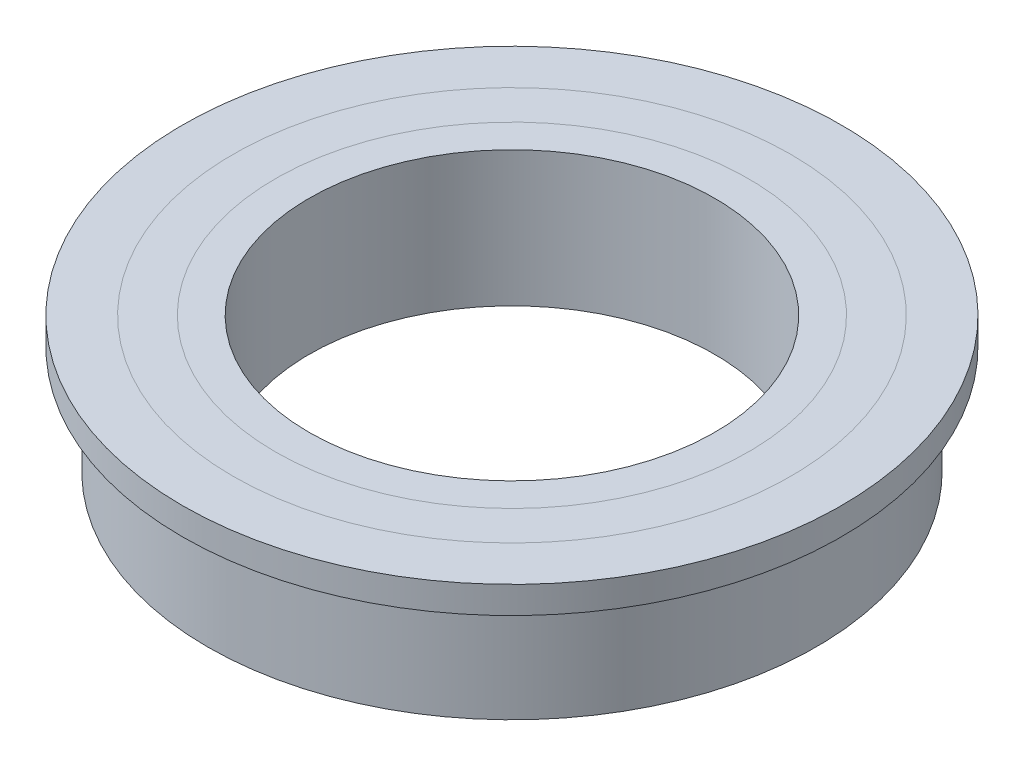
ISO-10303-21;
HEADER;
FILE_DESCRIPTION(('STEP AP214'),'2;1');
FILE_NAME('part.step','',(''),(''),'','','');
FILE_SCHEMA(('AUTOMOTIVE_DESIGN { 1 0 10303 214 1 1 1 1 }'));
ENDSEC;
DATA;
#1=APPLICATION_CONTEXT('core data for automotive mechanical design processes');
#2=APPLICATION_PROTOCOL_DEFINITION('international standard','automotive_design',2000,#1);
#3=PRODUCT_CONTEXT('',#1,'mechanical');
#4=PRODUCT('Part','Part','',(#3));
#5=PRODUCT_RELATED_PRODUCT_CATEGORY('part','',(#4));
#6=PRODUCT_DEFINITION_FORMATION('','',#4);
#7=PRODUCT_DEFINITION_CONTEXT('part definition',#1,'design');
#8=PRODUCT_DEFINITION('design','',#6,#7);
#9=PRODUCT_DEFINITION_SHAPE('','',#8);
#10=(LENGTH_UNIT() NAMED_UNIT(*) SI_UNIT(.MILLI.,.METRE.));
#11=(NAMED_UNIT(*) PLANE_ANGLE_UNIT() SI_UNIT($,.RADIAN.));
#12=(NAMED_UNIT(*) SI_UNIT($,.STERADIAN.) SOLID_ANGLE_UNIT());
#13=UNCERTAINTY_MEASURE_WITH_UNIT(LENGTH_MEASURE(1.E-05),#10,'distance_accuracy_value','');
#14=(GEOMETRIC_REPRESENTATION_CONTEXT(3) GLOBAL_UNCERTAINTY_ASSIGNED_CONTEXT((#13)) GLOBAL_UNIT_ASSIGNED_CONTEXT((#10,
#11,#12)) REPRESENTATION_CONTEXT('',''));
#15=CARTESIAN_POINT('',(0.,0.,0.));
#16=DIRECTION('',(0.,0.,1.));
#17=DIRECTION('',(1.,0.,0.));
#18=AXIS2_PLACEMENT_3D('',#15,#16,#17);
#19=CARTESIAN_POINT('',(0.,4.01,0.));
#20=DIRECTION('',(0.,-1.,0.));
#21=DIRECTION('',(0.,0.,-1.));
#22=AXIS2_PLACEMENT_3D('',#19,#20,#21);
#23=CYLINDRICAL_SURFACE('',#22,7.);
#24=CARTESIAN_POINT('',(0.,4.,0.));
#25=DIRECTION('',(0.,1.,0.));
#26=DIRECTION('',(0.,0.,1.));
#27=AXIS2_PLACEMENT_3D('',#24,#25,#26);
#28=CIRCLE('',#27,7.);
#29=CARTESIAN_POINT('',(0.,4.,7.));
#30=VERTEX_POINT('',#29);
#31=EDGE_CURVE('E47',#30,#30,#28,.T.);
#32=ORIENTED_EDGE('',*,*,#31,.T.);
#33=EDGE_LOOP('',(#32));
#34=FACE_BOUND('',#33,.T.);
#35=CARTESIAN_POINT('',(0.,0.,0.));
#36=DIRECTION('',(0.,1.,0.));
#37=DIRECTION('',(0.,0.,1.));
#38=AXIS2_PLACEMENT_3D('',#35,#36,#37);
#39=CIRCLE('',#38,7.);
#40=CARTESIAN_POINT('',(0.,0.,7.));
#41=VERTEX_POINT('',#40);
#42=EDGE_CURVE('E11',#41,#41,#39,.T.);
#43=ORIENTED_EDGE('',*,*,#42,.F.);
#44=EDGE_LOOP('',(#43));
#45=FACE_BOUND('',#44,.T.);
#46=ADVANCED_FACE('F43',(#34,#45),#23,.F.);
#47=CARTESIAN_POINT('',(0.,4.01,0.));
#48=DIRECTION('',(0.,-1.,0.));
#49=DIRECTION('',(0.,0.,-1.));
#50=AXIS2_PLACEMENT_3D('',#47,#48,#49);
#51=CYLINDRICAL_SURFACE('',#50,8.25);
#52=CARTESIAN_POINT('',(0.,0.,0.));
#53=DIRECTION('',(0.,1.,0.));
#54=DIRECTION('',(0.,0.,1.));
#55=AXIS2_PLACEMENT_3D('',#52,#53,#54);
#56=CIRCLE('',#55,8.25);
#57=CARTESIAN_POINT('',(0.,0.,8.25));
#58=VERTEX_POINT('',#57);
#59=EDGE_CURVE('E57',#58,#58,#56,.T.);
#60=ORIENTED_EDGE('',*,*,#59,.T.);
#61=EDGE_LOOP('',(#60));
#62=FACE_BOUND('',#61,.T.);
#63=CARTESIAN_POINT('',(0.,4.,0.));
#64=DIRECTION('',(0.,1.,0.));
#65=DIRECTION('',(0.,0.,1.));
#66=AXIS2_PLACEMENT_3D('',#63,#64,#65);
#67=CIRCLE('',#66,8.25);
#68=CARTESIAN_POINT('',(0.,4.,8.25));
#69=VERTEX_POINT('',#68);
#70=EDGE_CURVE('E51',#69,#69,#67,.T.);
#71=ORIENTED_EDGE('',*,*,#70,.F.);
#72=EDGE_LOOP('',(#71));
#73=FACE_BOUND('',#72,.T.);
#74=ADVANCED_FACE('F69',(#62,#73),#51,.T.);
#75=CARTESIAN_POINT('',(0.,0.,0.));
#76=DIRECTION('',(0.,1.,0.));
#77=DIRECTION('',(0.,0.,1.));
#78=AXIS2_PLACEMENT_3D('',#75,#76,#77);
#79=PLANE('',#78);
#80=ORIENTED_EDGE('',*,*,#42,.T.);
#81=EDGE_LOOP('',(#80));
#82=FACE_BOUND('',#81,.T.);
#83=ORIENTED_EDGE('',*,*,#59,.F.);
#84=EDGE_LOOP('',(#83));
#85=FACE_BOUND('',#84,.T.);
#86=ADVANCED_FACE('F68',(#82,#85),#79,.F.);
#87=CARTESIAN_POINT('',(0.,4.,0.));
#88=DIRECTION('',(0.,1.,0.));
#89=DIRECTION('',(0.,0.,1.));
#90=AXIS2_PLACEMENT_3D('',#87,#88,#89);
#91=PLANE('',#90);
#92=ORIENTED_EDGE('',*,*,#31,.F.);
#93=EDGE_LOOP('',(#92));
#94=FACE_BOUND('',#93,.T.);
#95=ORIENTED_EDGE('',*,*,#70,.T.);
#96=EDGE_LOOP('',(#95));
#97=FACE_BOUND('',#96,.T.);
#98=ADVANCED_FACE('F45',(#94,#97),#91,.T.);
#99=CLOSED_SHELL('',(#46,#74,#86,#98));
#100=MANIFOLD_SOLID_BREP('B2',#99);
#101=CARTESIAN_POINT('',(0.,4.01,0.));
#102=DIRECTION('',(0.,-1.,0.));
#103=DIRECTION('',(0.,0.,-1.));
#104=AXIS2_PLACEMENT_3D('',#101,#102,#103);
#105=CYLINDRICAL_SURFACE('',#104,7.);
#106=CARTESIAN_POINT('',(0.,0.,0.));
#107=DIRECTION('',(0.,1.,0.));
#108=DIRECTION('',(0.,0.,1.));
#109=AXIS2_PLACEMENT_3D('',#106,#107,#108);
#110=CIRCLE('',#109,7.);
#111=CARTESIAN_POINT('',(0.,0.,7.));
#112=VERTEX_POINT('',#111);
#113=EDGE_CURVE('E128',#112,#112,#110,.T.);
#114=ORIENTED_EDGE('',*,*,#113,.T.);
#115=EDGE_LOOP('',(#114));
#116=FACE_BOUND('',#115,.T.);
#117=CARTESIAN_POINT('',(0.,4.,0.));
#118=DIRECTION('',(0.,1.,0.));
#119=DIRECTION('',(0.,0.,1.));
#120=AXIS2_PLACEMENT_3D('',#117,#118,#119);
#121=CIRCLE('',#120,7.);
#122=CARTESIAN_POINT('',(0.,4.,7.));
#123=VERTEX_POINT('',#122);
#124=EDGE_CURVE('E118',#123,#123,#121,.T.);
#125=ORIENTED_EDGE('',*,*,#124,.F.);
#126=EDGE_LOOP('',(#125));
#127=FACE_BOUND('',#126,.T.);
#128=ADVANCED_FACE('F114',(#116,#127),#105,.T.);
#129=CARTESIAN_POINT('',(0.,4.,0.));
#130=DIRECTION('',(0.,-1.,0.));
#131=DIRECTION('',(0.,0.,-1.));
#132=AXIS2_PLACEMENT_3D('',#129,#130,#131);
#133=CYLINDRICAL_SURFACE('',#132,6.);
#134=CARTESIAN_POINT('',(0.,4.,0.));
#135=DIRECTION('',(0.,1.,0.));
#136=DIRECTION('',(0.,0.,1.));
#137=AXIS2_PLACEMENT_3D('',#134,#135,#136);
#138=CIRCLE('',#137,6.);
#139=CARTESIAN_POINT('',(0.,4.,6.));
#140=VERTEX_POINT('',#139);
#141=EDGE_CURVE('E122',#140,#140,#138,.T.);
#142=ORIENTED_EDGE('',*,*,#141,.T.);
#143=EDGE_LOOP('',(#142));
#144=FACE_BOUND('',#143,.T.);
#145=CARTESIAN_POINT('',(0.,0.,0.));
#146=DIRECTION('',(0.,1.,0.));
#147=DIRECTION('',(0.,0.,1.));
#148=AXIS2_PLACEMENT_3D('',#145,#146,#147);
#149=CIRCLE('',#148,6.);
#150=CARTESIAN_POINT('',(0.,0.,6.));
#151=VERTEX_POINT('',#150);
#152=EDGE_CURVE('E42',#151,#151,#149,.T.);
#153=ORIENTED_EDGE('',*,*,#152,.F.);
#154=EDGE_LOOP('',(#153));
#155=FACE_BOUND('',#154,.T.);
#156=ADVANCED_FACE('F137',(#144,#155),#133,.F.);
#157=CARTESIAN_POINT('',(0.,0.,0.));
#158=DIRECTION('',(0.,1.,0.));
#159=DIRECTION('',(0.,0.,1.));
#160=AXIS2_PLACEMENT_3D('',#157,#158,#159);
#161=PLANE('',#160);
#162=ORIENTED_EDGE('',*,*,#152,.T.);
#163=EDGE_LOOP('',(#162));
#164=FACE_BOUND('',#163,.T.);
#165=ORIENTED_EDGE('',*,*,#113,.F.);
#166=EDGE_LOOP('',(#165));
#167=FACE_BOUND('',#166,.T.);
#168=ADVANCED_FACE('F142',(#164,#167),#161,.F.);
#169=CARTESIAN_POINT('',(0.,4.,0.));
#170=DIRECTION('',(0.,1.,0.));
#171=DIRECTION('',(0.,0.,1.));
#172=AXIS2_PLACEMENT_3D('',#169,#170,#171);
#173=PLANE('',#172);
#174=ORIENTED_EDGE('',*,*,#141,.F.);
#175=EDGE_LOOP('',(#174));
#176=FACE_BOUND('',#175,.T.);
#177=ORIENTED_EDGE('',*,*,#124,.T.);
#178=EDGE_LOOP('',(#177));
#179=FACE_BOUND('',#178,.T.);
#180=ADVANCED_FACE('F116',(#176,#179),#173,.T.);
#181=CLOSED_SHELL('',(#128,#156,#168,#180));
#182=MANIFOLD_SOLID_BREP('B6',#181);
#183=CARTESIAN_POINT('',(0.,4.01,0.));
#184=DIRECTION('',(0.,-1.,0.));
#185=DIRECTION('',(0.,0.,-1.));
#186=AXIS2_PLACEMENT_3D('',#183,#184,#185);
#187=CYLINDRICAL_SURFACE('',#186,8.25);
#188=CARTESIAN_POINT('',(0.,4.,0.));
#189=DIRECTION('',(0.,1.,0.));
#190=DIRECTION('',(0.,0.,1.));
#191=AXIS2_PLACEMENT_3D('',#188,#189,#190);
#192=CIRCLE('',#191,8.25);
#193=CARTESIAN_POINT('',(0.,4.,8.25));
#194=VERTEX_POINT('',#193);
#195=EDGE_CURVE('E113',#194,#194,#192,.T.);
#196=ORIENTED_EDGE('',*,*,#195,.T.);
#197=EDGE_LOOP('',(#196));
#198=FACE_BOUND('',#197,.T.);
#199=CARTESIAN_POINT('',(0.,0.,0.));
#200=DIRECTION('',(0.,1.,0.));
#201=DIRECTION('',(0.,0.,1.));
#202=AXIS2_PLACEMENT_3D('',#199,#200,#201);
#203=CIRCLE('',#202,8.25);
#204=CARTESIAN_POINT('',(0.,0.,8.25));
#205=VERTEX_POINT('',#204);
#206=EDGE_CURVE('E184',#205,#205,#203,.T.);
#207=ORIENTED_EDGE('',*,*,#206,.F.);
#208=EDGE_LOOP('',(#207));
#209=FACE_BOUND('',#208,.T.);
#210=ADVANCED_FACE('F178',(#198,#209),#187,.F.);
#211=CARTESIAN_POINT('',(0.,3.2,0.));
#212=DIRECTION('',(0.,1.,0.));
#213=DIRECTION('',(0.,0.,1.));
#214=AXIS2_PLACEMENT_3D('',#211,#212,#213);
#215=PLANE('',#214);
#216=CARTESIAN_POINT('',(0.,3.2,0.));
#217=DIRECTION('',(0.,1.,0.));
#218=DIRECTION('',(0.,0.,1.));
#219=AXIS2_PLACEMENT_3D('',#216,#217,#218);
#220=CIRCLE('',#219,9.75);
#221=CARTESIAN_POINT('',(0.,3.2,9.75));
#222=VERTEX_POINT('',#221);
#223=EDGE_CURVE('E196',#222,#222,#220,.T.);
#224=ORIENTED_EDGE('',*,*,#223,.F.);
#225=EDGE_LOOP('',(#224));
#226=FACE_BOUND('',#225,.T.);
#227=CARTESIAN_POINT('',(0.,3.2,0.));
#228=DIRECTION('',(0.,1.,0.));
#229=DIRECTION('',(0.,0.,1.));
#230=AXIS2_PLACEMENT_3D('',#227,#228,#229);
#231=CIRCLE('',#230,9.);
#232=CARTESIAN_POINT('',(0.,3.2,9.));
#233=VERTEX_POINT('',#232);
#234=EDGE_CURVE('E188',#233,#233,#231,.T.);
#235=ORIENTED_EDGE('',*,*,#234,.T.);
#236=EDGE_LOOP('',(#235));
#237=FACE_BOUND('',#236,.T.);
#238=ADVANCED_FACE('F207',(#226,#237),#215,.F.);
#239=CARTESIAN_POINT('',(0.,4.,0.));
#240=DIRECTION('',(0.,-1.,0.));
#241=DIRECTION('',(0.,0.,-1.));
#242=AXIS2_PLACEMENT_3D('',#239,#240,#241);
#243=CYLINDRICAL_SURFACE('',#242,9.);
#244=CARTESIAN_POINT('',(0.,0.,0.));
#245=DIRECTION('',(0.,1.,0.));
#246=DIRECTION('',(0.,0.,1.));
#247=AXIS2_PLACEMENT_3D('',#244,#245,#246);
#248=CIRCLE('',#247,9.);
#249=CARTESIAN_POINT('',(0.,0.,9.));
#250=VERTEX_POINT('',#249);
#251=EDGE_CURVE('E192',#250,#250,#248,.T.);
#252=ORIENTED_EDGE('',*,*,#251,.T.);
#253=EDGE_LOOP('',(#252));
#254=FACE_BOUND('',#253,.T.);
#255=ORIENTED_EDGE('',*,*,#234,.F.);
#256=EDGE_LOOP('',(#255));
#257=FACE_BOUND('',#256,.T.);
#258=ADVANCED_FACE('F210',(#254,#257),#243,.T.);
#259=CARTESIAN_POINT('',(0.,0.,0.));
#260=DIRECTION('',(0.,1.,0.));
#261=DIRECTION('',(0.,0.,1.));
#262=AXIS2_PLACEMENT_3D('',#259,#260,#261);
#263=PLANE('',#262);
#264=ORIENTED_EDGE('',*,*,#206,.T.);
#265=EDGE_LOOP('',(#264));
#266=FACE_BOUND('',#265,.T.);
#267=ORIENTED_EDGE('',*,*,#251,.F.);
#268=EDGE_LOOP('',(#267));
#269=FACE_BOUND('',#268,.T.);
#270=ADVANCED_FACE('F215',(#266,#269),#263,.F.);
#271=CARTESIAN_POINT('',(0.,3.2,0.));
#272=DIRECTION('',(0.,1.,0.));
#273=DIRECTION('',(0.,0.,1.));
#274=AXIS2_PLACEMENT_3D('',#271,#272,#273);
#275=CYLINDRICAL_SURFACE('',#274,9.75);
#276=ORIENTED_EDGE('',*,*,#223,.T.);
#277=EDGE_LOOP('',(#276));
#278=FACE_BOUND('',#277,.T.);
#279=CARTESIAN_POINT('',(0.,4.,0.));
#280=DIRECTION('',(0.,1.,0.));
#281=DIRECTION('',(0.,0.,1.));
#282=AXIS2_PLACEMENT_3D('',#279,#280,#281);
#283=CIRCLE('',#282,9.75);
#284=CARTESIAN_POINT('',(0.,4.,9.75));
#285=VERTEX_POINT('',#284);
#286=EDGE_CURVE('E198',#285,#285,#283,.T.);
#287=ORIENTED_EDGE('',*,*,#286,.F.);
#288=EDGE_LOOP('',(#287));
#289=FACE_BOUND('',#288,.T.);
#290=ADVANCED_FACE('F204',(#278,#289),#275,.T.);
#291=CARTESIAN_POINT('',(0.,4.,0.));
#292=DIRECTION('',(0.,1.,0.));
#293=DIRECTION('',(0.,0.,1.));
#294=AXIS2_PLACEMENT_3D('',#291,#292,#293);
#295=PLANE('',#294);
#296=ORIENTED_EDGE('',*,*,#195,.F.);
#297=EDGE_LOOP('',(#296));
#298=FACE_BOUND('',#297,.T.);
#299=ORIENTED_EDGE('',*,*,#286,.T.);
#300=EDGE_LOOP('',(#299));
#301=FACE_BOUND('',#300,.T.);
#302=ADVANCED_FACE('F244',(#298,#301),#295,.T.);
#303=CLOSED_SHELL('',(#210,#238,#258,#270,#290,#302));
#304=MANIFOLD_SOLID_BREP('B37',#303);
#305=ADVANCED_BREP_SHAPE_REPRESENTATION('',(#18,#100,#182,#304),#14);
#306=SHAPE_DEFINITION_REPRESENTATION(#9,#305);
ENDSEC;
END-ISO-10303-21;
